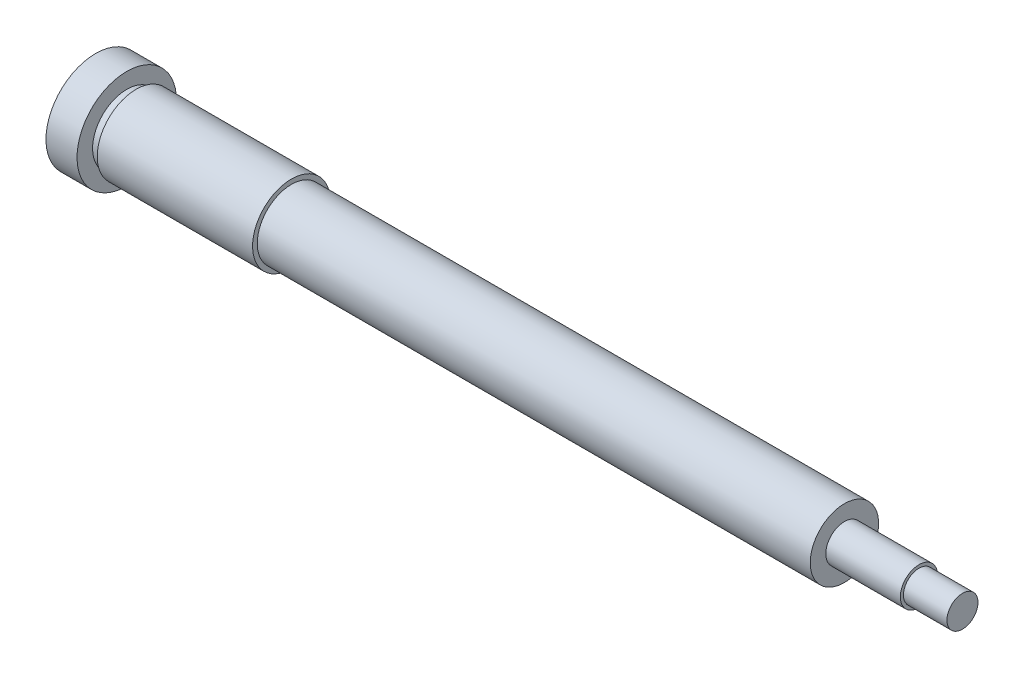
ISO-10303-21;
HEADER;
FILE_DESCRIPTION(('STEP AP214'),'2;1');
FILE_NAME('part.step','',(''),(''),'','','');
FILE_SCHEMA(('AUTOMOTIVE_DESIGN { 1 0 10303 214 1 1 1 1 }'));
ENDSEC;
DATA;
#1=APPLICATION_CONTEXT('core data for automotive mechanical design processes');
#2=APPLICATION_PROTOCOL_DEFINITION('international standard','automotive_design',2000,#1);
#3=PRODUCT_CONTEXT('',#1,'mechanical');
#4=PRODUCT('Part','Part','',(#3));
#5=PRODUCT_RELATED_PRODUCT_CATEGORY('part','',(#4));
#6=PRODUCT_DEFINITION_FORMATION('','',#4);
#7=PRODUCT_DEFINITION_CONTEXT('part definition',#1,'design');
#8=PRODUCT_DEFINITION('design','',#6,#7);
#9=PRODUCT_DEFINITION_SHAPE('','',#8);
#10=(LENGTH_UNIT() NAMED_UNIT(*) SI_UNIT(.MILLI.,.METRE.));
#11=(NAMED_UNIT(*) PLANE_ANGLE_UNIT() SI_UNIT($,.RADIAN.));
#12=(NAMED_UNIT(*) SI_UNIT($,.STERADIAN.) SOLID_ANGLE_UNIT());
#13=UNCERTAINTY_MEASURE_WITH_UNIT(LENGTH_MEASURE(1.E-05),#10,'distance_accuracy_value','');
#14=(GEOMETRIC_REPRESENTATION_CONTEXT(3) GLOBAL_UNCERTAINTY_ASSIGNED_CONTEXT((#13)) GLOBAL_UNIT_ASSIGNED_CONTEXT((#10,
#11,#12)) REPRESENTATION_CONTEXT('',''));
#15=CARTESIAN_POINT('',(0.,0.,0.));
#16=DIRECTION('',(0.,0.,1.));
#17=DIRECTION('',(1.,0.,0.));
#18=AXIS2_PLACEMENT_3D('',#15,#16,#17);
#19=CARTESIAN_POINT('',(-279.,0.,0.));
#20=DIRECTION('',(-1.,0.,0.));
#21=DIRECTION('',(0.,-1.,0.));
#22=AXIS2_PLACEMENT_3D('',#19,#20,#21);
#23=PLANE('',#22);
#24=CARTESIAN_POINT('',(-279.,0.,0.));
#25=DIRECTION('',(1.,0.,0.));
#26=DIRECTION('',(0.,1.,0.));
#27=AXIS2_PLACEMENT_3D('',#24,#25,#26);
#28=CIRCLE('',#27,16.);
#29=CARTESIAN_POINT('',(-279.,16.,0.));
#30=VERTEX_POINT('',#29);
#31=EDGE_CURVE('E10',#30,#30,#28,.T.);
#32=ORIENTED_EDGE('',*,*,#31,.F.);
#33=EDGE_LOOP('',(#32));
#34=FACE_BOUND('',#33,.T.);
#35=ADVANCED_FACE('F35',(#34),#23,.T.);
#36=CARTESIAN_POINT('',(0.,0.,0.));
#37=DIRECTION('',(1.,0.,0.));
#38=DIRECTION('',(0.,1.,0.));
#39=AXIS2_PLACEMENT_3D('',#36,#37,#38);
#40=CYLINDRICAL_SURFACE('',#39,16.);
#41=ORIENTED_EDGE('',*,*,#31,.T.);
#42=EDGE_LOOP('',(#41));
#43=FACE_BOUND('',#42,.T.);
#44=CARTESIAN_POINT('',(-269.,0.,0.));
#45=DIRECTION('',(1.,0.,0.));
#46=DIRECTION('',(0.,1.,0.));
#47=AXIS2_PLACEMENT_3D('',#44,#45,#46);
#48=CIRCLE('',#47,16.);
#49=CARTESIAN_POINT('',(-269.,16.,0.));
#50=VERTEX_POINT('',#49);
#51=EDGE_CURVE('E41',#50,#50,#48,.T.);
#52=ORIENTED_EDGE('',*,*,#51,.F.);
#53=EDGE_LOOP('',(#52));
#54=FACE_BOUND('',#53,.T.);
#55=ADVANCED_FACE('F95',(#43,#54),#40,.T.);
#56=CARTESIAN_POINT('',(-269.,16.,0.));
#57=DIRECTION('',(1.,0.,0.));
#58=DIRECTION('',(0.,1.,0.));
#59=AXIS2_PLACEMENT_3D('',#56,#57,#58);
#60=PLANE('',#59);
#61=ORIENTED_EDGE('',*,*,#51,.T.);
#62=EDGE_LOOP('',(#61));
#63=FACE_BOUND('',#62,.T.);
#64=CARTESIAN_POINT('',(-269.,0.,0.));
#65=DIRECTION('',(1.,0.,0.));
#66=DIRECTION('',(0.,1.,0.));
#67=AXIS2_PLACEMENT_3D('',#64,#65,#66);
#68=CIRCLE('',#67,11.);
#69=CARTESIAN_POINT('',(-269.,11.,0.));
#70=VERTEX_POINT('',#69);
#71=EDGE_CURVE('E45',#70,#70,#68,.T.);
#72=ORIENTED_EDGE('',*,*,#71,.F.);
#73=EDGE_LOOP('',(#72));
#74=FACE_BOUND('',#73,.T.);
#75=ADVANCED_FACE('F100',(#63,#74),#60,.T.);
#76=CARTESIAN_POINT('',(0.,0.,0.));
#77=DIRECTION('',(1.,0.,0.));
#78=DIRECTION('',(0.,1.,0.));
#79=AXIS2_PLACEMENT_3D('',#76,#77,#78);
#80=CYLINDRICAL_SURFACE('',#79,11.);
#81=ORIENTED_EDGE('',*,*,#71,.T.);
#82=EDGE_LOOP('',(#81));
#83=FACE_BOUND('',#82,.T.);
#84=CARTESIAN_POINT('',(-266.,0.,0.));
#85=DIRECTION('',(1.,0.,0.));
#86=DIRECTION('',(0.,1.,0.));
#87=AXIS2_PLACEMENT_3D('',#84,#85,#86);
#88=CIRCLE('',#87,11.);
#89=CARTESIAN_POINT('',(-266.,11.,0.));
#90=VERTEX_POINT('',#89);
#91=EDGE_CURVE('E49',#90,#90,#88,.T.);
#92=ORIENTED_EDGE('',*,*,#91,.F.);
#93=EDGE_LOOP('',(#92));
#94=FACE_BOUND('',#93,.T.);
#95=ADVANCED_FACE('F104',(#83,#94),#80,.T.);
#96=CARTESIAN_POINT('',(-266.,11.,0.));
#97=DIRECTION('',(-1.,0.,0.));
#98=DIRECTION('',(0.,-1.,0.));
#99=AXIS2_PLACEMENT_3D('',#96,#97,#98);
#100=PLANE('',#99);
#101=ORIENTED_EDGE('',*,*,#91,.T.);
#102=EDGE_LOOP('',(#101));
#103=FACE_BOUND('',#102,.T.);
#104=CARTESIAN_POINT('',(-266.,0.,0.));
#105=DIRECTION('',(1.,0.,0.));
#106=DIRECTION('',(0.,1.,0.));
#107=AXIS2_PLACEMENT_3D('',#104,#105,#106);
#108=CIRCLE('',#107,12.5);
#109=CARTESIAN_POINT('',(-266.,12.5,0.));
#110=VERTEX_POINT('',#109);
#111=EDGE_CURVE('E54',#110,#110,#108,.T.);
#112=ORIENTED_EDGE('',*,*,#111,.F.);
#113=EDGE_LOOP('',(#112));
#114=FACE_BOUND('',#113,.T.);
#115=ADVANCED_FACE('F110',(#103,#114),#100,.T.);
#116=CARTESIAN_POINT('',(0.,0.,0.));
#117=DIRECTION('',(1.,0.,0.));
#118=DIRECTION('',(0.,1.,0.));
#119=AXIS2_PLACEMENT_3D('',#116,#117,#118);
#120=CYLINDRICAL_SURFACE('',#119,12.5);
#121=ORIENTED_EDGE('',*,*,#111,.T.);
#122=EDGE_LOOP('',(#121));
#123=FACE_BOUND('',#122,.T.);
#124=CARTESIAN_POINT('',(-216.,0.,0.));
#125=DIRECTION('',(1.,0.,0.));
#126=DIRECTION('',(0.,1.,0.));
#127=AXIS2_PLACEMENT_3D('',#124,#125,#126);
#128=CIRCLE('',#127,12.5);
#129=CARTESIAN_POINT('',(-216.,12.5,0.));
#130=VERTEX_POINT('',#129);
#131=EDGE_CURVE('E57',#130,#130,#128,.T.);
#132=ORIENTED_EDGE('',*,*,#131,.F.);
#133=EDGE_LOOP('',(#132));
#134=FACE_BOUND('',#133,.T.);
#135=ADVANCED_FACE('F114',(#123,#134),#120,.T.);
#136=CARTESIAN_POINT('',(-216.,12.5,0.));
#137=DIRECTION('',(1.,0.,0.));
#138=DIRECTION('',(0.,1.,0.));
#139=AXIS2_PLACEMENT_3D('',#136,#137,#138);
#140=PLANE('',#139);
#141=ORIENTED_EDGE('',*,*,#131,.T.);
#142=EDGE_LOOP('',(#141));
#143=FACE_BOUND('',#142,.T.);
#144=CARTESIAN_POINT('',(-216.,0.,0.));
#145=DIRECTION('',(1.,0.,0.));
#146=DIRECTION('',(0.,1.,0.));
#147=AXIS2_PLACEMENT_3D('',#144,#145,#146);
#148=CIRCLE('',#147,11.);
#149=CARTESIAN_POINT('',(-216.,11.,0.));
#150=VERTEX_POINT('',#149);
#151=EDGE_CURVE('E60',#150,#150,#148,.T.);
#152=ORIENTED_EDGE('',*,*,#151,.F.);
#153=EDGE_LOOP('',(#152));
#154=FACE_BOUND('',#153,.T.);
#155=ADVANCED_FACE('F118',(#143,#154),#140,.T.);
#156=CARTESIAN_POINT('',(0.,0.,0.));
#157=DIRECTION('',(1.,0.,0.));
#158=DIRECTION('',(0.,1.,0.));
#159=AXIS2_PLACEMENT_3D('',#156,#157,#158);
#160=CYLINDRICAL_SURFACE('',#159,11.);
#161=ORIENTED_EDGE('',*,*,#151,.T.);
#162=EDGE_LOOP('',(#161));
#163=FACE_BOUND('',#162,.T.);
#164=CARTESIAN_POINT('',(-38.,0.,0.));
#165=DIRECTION('',(1.,0.,0.));
#166=DIRECTION('',(0.,1.,0.));
#167=AXIS2_PLACEMENT_3D('',#164,#165,#166);
#168=CIRCLE('',#167,11.);
#169=CARTESIAN_POINT('',(-38.,11.,0.));
#170=VERTEX_POINT('',#169);
#171=EDGE_CURVE('E63',#170,#170,#168,.T.);
#172=ORIENTED_EDGE('',*,*,#171,.F.);
#173=EDGE_LOOP('',(#172));
#174=FACE_BOUND('',#173,.T.);
#175=ADVANCED_FACE('F122',(#163,#174),#160,.T.);
#176=CARTESIAN_POINT('',(-38.,11.,0.));
#177=DIRECTION('',(1.,0.,0.));
#178=DIRECTION('',(0.,1.,0.));
#179=AXIS2_PLACEMENT_3D('',#176,#177,#178);
#180=PLANE('',#179);
#181=ORIENTED_EDGE('',*,*,#171,.T.);
#182=EDGE_LOOP('',(#181));
#183=FACE_BOUND('',#182,.T.);
#184=CARTESIAN_POINT('',(-38.,0.,0.));
#185=DIRECTION('',(1.,0.,0.));
#186=DIRECTION('',(0.,1.,0.));
#187=AXIS2_PLACEMENT_3D('',#184,#185,#186);
#188=CIRCLE('',#187,6.);
#189=CARTESIAN_POINT('',(-38.,5.99999999999999,0.));
#190=VERTEX_POINT('',#189);
#191=EDGE_CURVE('E66',#190,#190,#188,.T.);
#192=ORIENTED_EDGE('',*,*,#191,.F.);
#193=EDGE_LOOP('',(#192));
#194=FACE_BOUND('',#193,.T.);
#195=ADVANCED_FACE('F126',(#183,#194),#180,.T.);
#196=CARTESIAN_POINT('',(0.,0.,0.));
#197=DIRECTION('',(1.,0.,0.));
#198=DIRECTION('',(0.,1.,0.));
#199=AXIS2_PLACEMENT_3D('',#196,#197,#198);
#200=CYLINDRICAL_SURFACE('',#199,6.);
#201=ORIENTED_EDGE('',*,*,#191,.T.);
#202=EDGE_LOOP('',(#201));
#203=FACE_BOUND('',#202,.T.);
#204=CARTESIAN_POINT('',(-14.,0.,0.));
#205=DIRECTION('',(1.,0.,0.));
#206=DIRECTION('',(0.,1.,0.));
#207=AXIS2_PLACEMENT_3D('',#204,#205,#206);
#208=CIRCLE('',#207,6.);
#209=CARTESIAN_POINT('',(-14.,5.99999999999999,0.));
#210=VERTEX_POINT('',#209);
#211=EDGE_CURVE('E69',#210,#210,#208,.T.);
#212=ORIENTED_EDGE('',*,*,#211,.F.);
#213=EDGE_LOOP('',(#212));
#214=FACE_BOUND('',#213,.T.);
#215=ADVANCED_FACE('F91',(#203,#214),#200,.T.);
#216=CARTESIAN_POINT('',(-14.,5.99999999999999,0.));
#217=DIRECTION('',(1.,0.,0.));
#218=DIRECTION('',(0.,1.,0.));
#219=AXIS2_PLACEMENT_3D('',#216,#217,#218);
#220=PLANE('',#219);
#221=ORIENTED_EDGE('',*,*,#211,.T.);
#222=EDGE_LOOP('',(#221));
#223=FACE_BOUND('',#222,.T.);
#224=CARTESIAN_POINT('',(-14.,0.,0.));
#225=DIRECTION('',(1.,0.,0.));
#226=DIRECTION('',(0.,1.,0.));
#227=AXIS2_PLACEMENT_3D('',#224,#225,#226);
#228=CIRCLE('',#227,5.);
#229=CARTESIAN_POINT('',(-14.,5.,0.));
#230=VERTEX_POINT('',#229);
#231=EDGE_CURVE('E72',#230,#230,#228,.T.);
#232=ORIENTED_EDGE('',*,*,#231,.F.);
#233=EDGE_LOOP('',(#232));
#234=FACE_BOUND('',#233,.T.);
#235=ADVANCED_FACE('F83',(#223,#234),#220,.T.);
#236=CARTESIAN_POINT('',(0.,0.,0.));
#237=DIRECTION('',(1.,0.,0.));
#238=DIRECTION('',(0.,1.,0.));
#239=AXIS2_PLACEMENT_3D('',#236,#237,#238);
#240=CYLINDRICAL_SURFACE('',#239,5.);
#241=ORIENTED_EDGE('',*,*,#231,.T.);
#242=EDGE_LOOP('',(#241));
#243=FACE_BOUND('',#242,.T.);
#244=CARTESIAN_POINT('',(0.,0.,0.));
#245=DIRECTION('',(1.,0.,0.));
#246=DIRECTION('',(0.,1.,0.));
#247=AXIS2_PLACEMENT_3D('',#244,#245,#246);
#248=CIRCLE('',#247,5.);
#249=CARTESIAN_POINT('',(0.,5.,0.));
#250=VERTEX_POINT('',#249);
#251=EDGE_CURVE('E75',#250,#250,#248,.T.);
#252=ORIENTED_EDGE('',*,*,#251,.F.);
#253=EDGE_LOOP('',(#252));
#254=FACE_BOUND('',#253,.T.);
#255=ADVANCED_FACE('F81',(#243,#254),#240,.T.);
#256=CARTESIAN_POINT('',(0.,5.,0.));
#257=DIRECTION('',(1.,0.,0.));
#258=DIRECTION('',(0.,1.,0.));
#259=AXIS2_PLACEMENT_3D('',#256,#257,#258);
#260=PLANE('',#259);
#261=ORIENTED_EDGE('',*,*,#251,.T.);
#262=EDGE_LOOP('',(#261));
#263=FACE_BOUND('',#262,.T.);
#264=ADVANCED_FACE('F79',(#263),#260,.T.);
#265=CLOSED_SHELL('',(#35,#55,#75,#95,#115,#135,#155,#175,#195,#215,#235,#255,#264));
#266=MANIFOLD_SOLID_BREP('B2',#265);
#267=ADVANCED_BREP_SHAPE_REPRESENTATION('',(#18,#266),#14);
#268=SHAPE_DEFINITION_REPRESENTATION(#9,#267);
ENDSEC;
END-ISO-10303-21;
